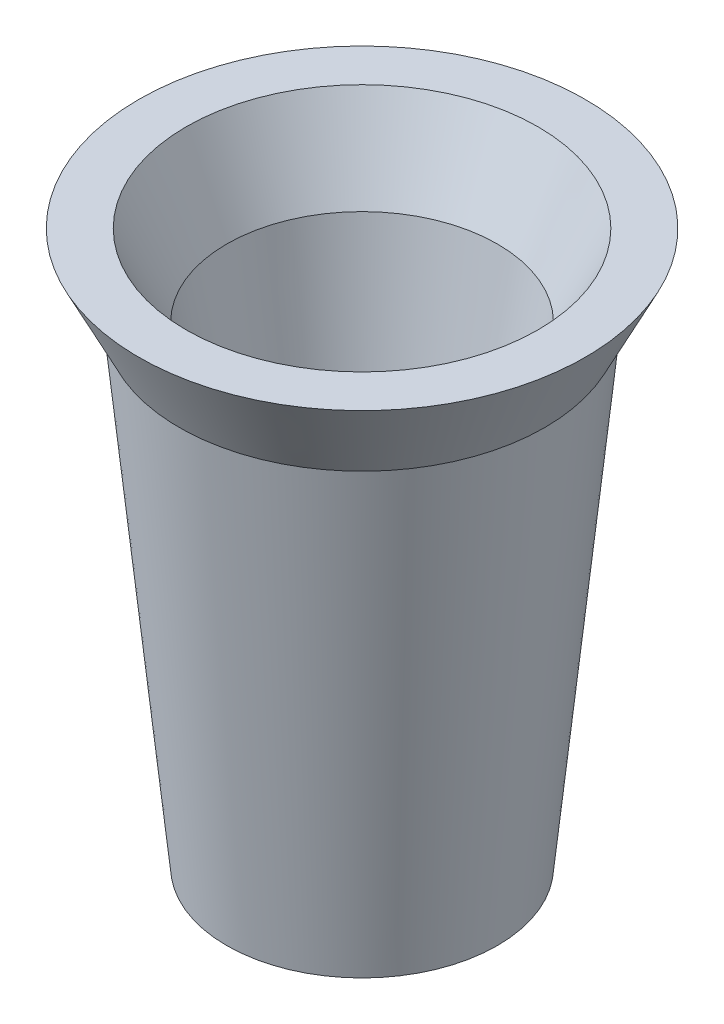
ISO-10303-21;
HEADER;
FILE_DESCRIPTION(('STEP AP214'),'2;1');
FILE_NAME('part.step','',(''),(''),'','','');
FILE_SCHEMA(('AUTOMOTIVE_DESIGN { 1 0 10303 214 1 1 1 1 }'));
ENDSEC;
DATA;
#1=APPLICATION_CONTEXT('core data for automotive mechanical design processes');
#2=APPLICATION_PROTOCOL_DEFINITION('international standard','automotive_design',2000,#1);
#3=PRODUCT_CONTEXT('',#1,'mechanical');
#4=PRODUCT('Part','Part','',(#3));
#5=PRODUCT_RELATED_PRODUCT_CATEGORY('part','',(#4));
#6=PRODUCT_DEFINITION_FORMATION('','',#4);
#7=PRODUCT_DEFINITION_CONTEXT('part definition',#1,'design');
#8=PRODUCT_DEFINITION('design','',#6,#7);
#9=PRODUCT_DEFINITION_SHAPE('','',#8);
#10=(LENGTH_UNIT() NAMED_UNIT(*) SI_UNIT(.MILLI.,.METRE.));
#11=(NAMED_UNIT(*) PLANE_ANGLE_UNIT() SI_UNIT($,.RADIAN.));
#12=(NAMED_UNIT(*) SI_UNIT($,.STERADIAN.) SOLID_ANGLE_UNIT());
#13=UNCERTAINTY_MEASURE_WITH_UNIT(LENGTH_MEASURE(1.E-05),#10,'distance_accuracy_value','');
#14=(GEOMETRIC_REPRESENTATION_CONTEXT(3) GLOBAL_UNCERTAINTY_ASSIGNED_CONTEXT((#13)) GLOBAL_UNIT_ASSIGNED_CONTEXT((#10,
#11,#12)) REPRESENTATION_CONTEXT('',''));
#15=CARTESIAN_POINT('',(0.,0.,0.));
#16=DIRECTION('',(0.,0.,1.));
#17=DIRECTION('',(1.,0.,0.));
#18=AXIS2_PLACEMENT_3D('',#15,#16,#17);
#19=CARTESIAN_POINT('',(0.,0.,0.));
#20=DIRECTION('',(0.,1.,0.));
#21=DIRECTION('',(-1.,0.,0.));
#22=AXIS2_PLACEMENT_3D('',#19,#20,#21);
#23=CONICAL_SURFACE('',#22,50.,0.0999523404268142);
#24=CARTESIAN_POINT('',(0.,174.5,0.));
#25=DIRECTION('',(0.,1.,0.));
#26=DIRECTION('',(-1.,0.,0.));
#27=AXIS2_PLACEMENT_3D('',#24,#25,#26);
#28=CIRCLE('',#27,67.5);
#29=CARTESIAN_POINT('',(-67.5,174.5,0.));
#30=VERTEX_POINT('',#29);
#31=EDGE_CURVE('E10',#30,#30,#28,.T.);
#32=ORIENTED_EDGE('',*,*,#31,.F.);
#33=EDGE_LOOP('',(#32));
#34=FACE_BOUND('',#33,.T.);
#35=CARTESIAN_POINT('',(0.,0.,0.));
#36=DIRECTION('',(0.,1.,0.));
#37=DIRECTION('',(-1.,0.,0.));
#38=AXIS2_PLACEMENT_3D('',#35,#36,#37);
#39=CIRCLE('',#38,50.);
#40=CARTESIAN_POINT('',(-50.,0.,0.));
#41=VERTEX_POINT('',#40);
#42=EDGE_CURVE('E65',#41,#41,#39,.T.);
#43=ORIENTED_EDGE('',*,*,#42,.T.);
#44=EDGE_LOOP('',(#43));
#45=FACE_BOUND('',#44,.T.);
#46=ADVANCED_FACE('F43',(#34,#45),#23,.T.);
#47=CARTESIAN_POINT('',(0.,204.5,0.));
#48=DIRECTION('',(0.,1.,0.));
#49=DIRECTION('',(-1.,0.,0.));
#50=AXIS2_PLACEMENT_3D('',#47,#48,#49);
#51=CONICAL_SURFACE('',#50,82.5,0.463647609000806);
#52=ORIENTED_EDGE('',*,*,#31,.T.);
#53=EDGE_LOOP('',(#52));
#54=FACE_BOUND('',#53,.T.);
#55=CARTESIAN_POINT('',(0.,204.5,0.));
#56=DIRECTION('',(0.,1.,0.));
#57=DIRECTION('',(-1.,0.,0.));
#58=AXIS2_PLACEMENT_3D('',#55,#56,#57);
#59=CIRCLE('',#58,82.5);
#60=CARTESIAN_POINT('',(-82.5,204.5,0.));
#61=VERTEX_POINT('',#60);
#62=EDGE_CURVE('E49',#61,#61,#59,.T.);
#63=ORIENTED_EDGE('',*,*,#62,.F.);
#64=EDGE_LOOP('',(#63));
#65=FACE_BOUND('',#64,.T.);
#66=ADVANCED_FACE('F90',(#54,#65),#51,.T.);
#67=CARTESIAN_POINT('',(0.,204.5,0.));
#68=DIRECTION('',(0.,1.,0.));
#69=DIRECTION('',(-1.,0.,0.));
#70=AXIS2_PLACEMENT_3D('',#67,#68,#69);
#71=PLANE('',#70);
#72=ORIENTED_EDGE('',*,*,#62,.T.);
#73=EDGE_LOOP('',(#72));
#74=FACE_BOUND('',#73,.T.);
#75=CARTESIAN_POINT('',(0.,204.5,0.));
#76=DIRECTION('',(0.,1.,0.));
#77=DIRECTION('',(-1.,0.,0.));
#78=AXIS2_PLACEMENT_3D('',#75,#76,#77);
#79=CIRCLE('',#78,65.);
#80=CARTESIAN_POINT('',(-65.,204.5,0.));
#81=VERTEX_POINT('',#80);
#82=EDGE_CURVE('E53',#81,#81,#79,.T.);
#83=ORIENTED_EDGE('',*,*,#82,.F.);
#84=EDGE_LOOP('',(#83));
#85=FACE_BOUND('',#84,.T.);
#86=ADVANCED_FACE('F84',(#74,#85),#71,.T.);
#87=CARTESIAN_POINT('',(0.,174.5,0.));
#88=DIRECTION('',(0.,1.,0.));
#89=DIRECTION('',(-1.,0.,0.));
#90=AXIS2_PLACEMENT_3D('',#87,#88,#89);
#91=CONICAL_SURFACE('',#90,50.,0.463647609000806);
#92=ORIENTED_EDGE('',*,*,#82,.T.);
#93=EDGE_LOOP('',(#92));
#94=FACE_BOUND('',#93,.T.);
#95=CARTESIAN_POINT('',(0.,174.5,0.));
#96=DIRECTION('',(0.,1.,0.));
#97=DIRECTION('',(-1.,0.,0.));
#98=AXIS2_PLACEMENT_3D('',#95,#96,#97);
#99=CIRCLE('',#98,50.);
#100=CARTESIAN_POINT('',(-50.,174.5,0.));
#101=VERTEX_POINT('',#100);
#102=EDGE_CURVE('E57',#101,#101,#99,.T.);
#103=ORIENTED_EDGE('',*,*,#102,.F.);
#104=EDGE_LOOP('',(#103));
#105=FACE_BOUND('',#104,.T.);
#106=ADVANCED_FACE('F79',(#94,#105),#91,.F.);
#107=CARTESIAN_POINT('',(0.,174.5,0.));
#108=DIRECTION('',(0.,1.,0.));
#109=DIRECTION('',(-1.,0.,0.));
#110=AXIS2_PLACEMENT_3D('',#107,#108,#109);
#111=CONICAL_SURFACE('',#110,50.,0.184136668359335);
#112=CARTESIAN_POINT('',(0.,0.,0.));
#113=DIRECTION('',(0.,1.,0.));
#114=DIRECTION('',(-1.,0.,0.));
#115=AXIS2_PLACEMENT_3D('',#112,#113,#114);
#116=CIRCLE('',#115,17.5);
#117=CARTESIAN_POINT('',(-17.5,0.,0.));
#118=VERTEX_POINT('',#117);
#119=EDGE_CURVE('E62',#118,#118,#116,.T.);
#120=ORIENTED_EDGE('',*,*,#119,.F.);
#121=EDGE_LOOP('',(#120));
#122=FACE_BOUND('',#121,.T.);
#123=ORIENTED_EDGE('',*,*,#102,.T.);
#124=EDGE_LOOP('',(#123));
#125=FACE_BOUND('',#124,.T.);
#126=ADVANCED_FACE('F73',(#122,#125),#111,.F.);
#127=CARTESIAN_POINT('',(0.,0.,0.));
#128=DIRECTION('',(0.,1.,0.));
#129=DIRECTION('',(-1.,0.,0.));
#130=AXIS2_PLACEMENT_3D('',#127,#128,#129);
#131=PLANE('',#130);
#132=ORIENTED_EDGE('',*,*,#42,.F.);
#133=EDGE_LOOP('',(#132));
#134=FACE_BOUND('',#133,.T.);
#135=ORIENTED_EDGE('',*,*,#119,.T.);
#136=EDGE_LOOP('',(#135));
#137=FACE_BOUND('',#136,.T.);
#138=ADVANCED_FACE('F70',(#134,#137),#131,.F.);
#139=CLOSED_SHELL('',(#46,#66,#86,#106,#126,#138));
#140=MANIFOLD_SOLID_BREP('B2',#139);
#141=ADVANCED_BREP_SHAPE_REPRESENTATION('',(#18,#140),#14);
#142=SHAPE_DEFINITION_REPRESENTATION(#9,#141);
ENDSEC;
END-ISO-10303-21;
